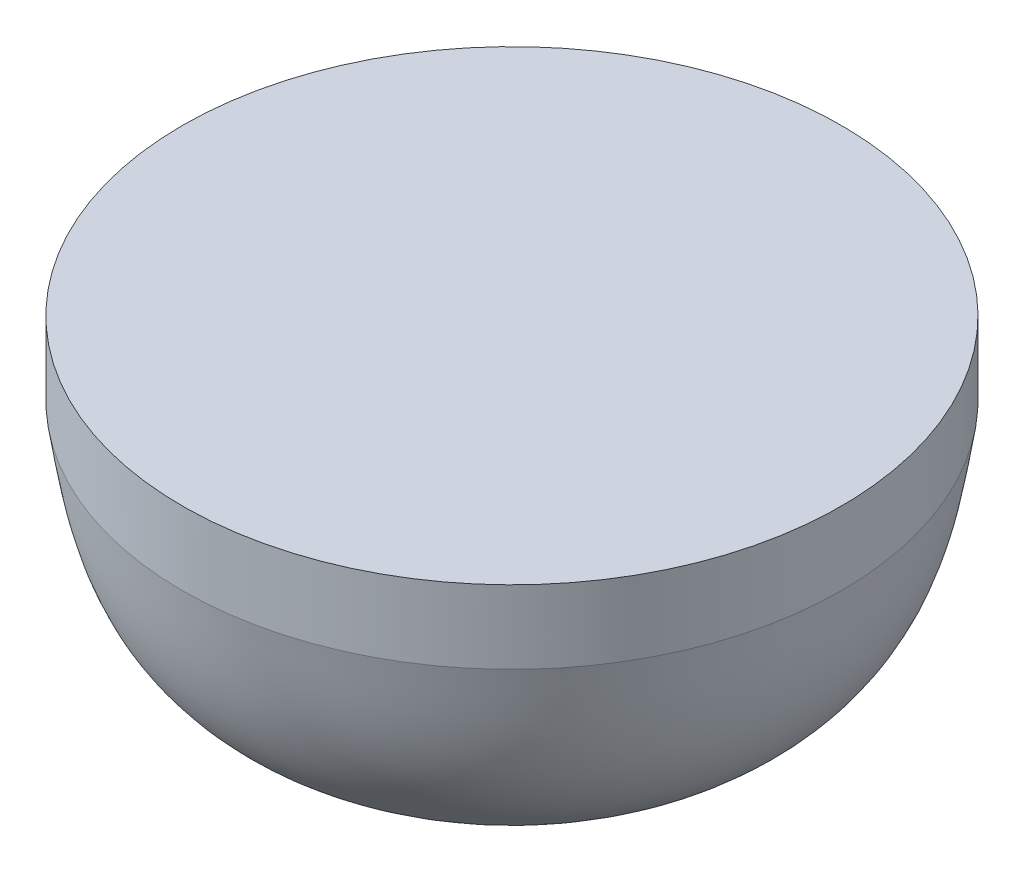
ISO-10303-21;
HEADER;
FILE_DESCRIPTION(('STEP AP214'),'2;1');
FILE_NAME('part.step','',(''),(''),'','','');
FILE_SCHEMA(('AUTOMOTIVE_DESIGN { 1 0 10303 214 1 1 1 1 }'));
ENDSEC;
DATA;
#1=APPLICATION_CONTEXT('core data for automotive mechanical design processes');
#2=APPLICATION_PROTOCOL_DEFINITION('international standard','automotive_design',2000,#1);
#3=PRODUCT_CONTEXT('',#1,'mechanical');
#4=PRODUCT('Part','Part','',(#3));
#5=PRODUCT_RELATED_PRODUCT_CATEGORY('part','',(#4));
#6=PRODUCT_DEFINITION_FORMATION('','',#4);
#7=PRODUCT_DEFINITION_CONTEXT('part definition',#1,'design');
#8=PRODUCT_DEFINITION('design','',#6,#7);
#9=PRODUCT_DEFINITION_SHAPE('','',#8);
#10=(LENGTH_UNIT() NAMED_UNIT(*) SI_UNIT(.MILLI.,.METRE.));
#11=(NAMED_UNIT(*) PLANE_ANGLE_UNIT() SI_UNIT($,.RADIAN.));
#12=(NAMED_UNIT(*) SI_UNIT($,.STERADIAN.) SOLID_ANGLE_UNIT());
#13=UNCERTAINTY_MEASURE_WITH_UNIT(LENGTH_MEASURE(1.E-05),#10,'distance_accuracy_value','');
#14=(GEOMETRIC_REPRESENTATION_CONTEXT(3) GLOBAL_UNCERTAINTY_ASSIGNED_CONTEXT((#13)) GLOBAL_UNIT_ASSIGNED_CONTEXT((#10,
#11,#12)) REPRESENTATION_CONTEXT('',''));
#15=CARTESIAN_POINT('',(0.,0.,0.));
#16=DIRECTION('',(0.,0.,1.));
#17=DIRECTION('',(1.,0.,0.));
#18=AXIS2_PLACEMENT_3D('',#15,#16,#17);
#19=CARTESIAN_POINT('',(18.,4.,0.));
#20=DIRECTION('',(0.,-1.,0.));
#21=DIRECTION('',(1.,0.,0.));
#22=AXIS2_PLACEMENT_3D('',#19,#20,#21);
#23=PLANE('',#22);
#24=CARTESIAN_POINT('',(0.,4.,0.));
#25=DIRECTION('',(0.,1.,0.));
#26=DIRECTION('',(-1.,0.,0.));
#27=AXIS2_PLACEMENT_3D('',#24,#25,#26);
#28=CIRCLE('',#27,18.);
#29=CARTESIAN_POINT('',(-18.,4.,0.));
#30=VERTEX_POINT('',#29);
#31=EDGE_CURVE('E11',#30,#30,#28,.T.);
#32=ORIENTED_EDGE('',*,*,#31,.T.);
#33=EDGE_LOOP('',(#32));
#34=FACE_BOUND('',#33,.T.);
#35=ADVANCED_FACE('F33',(#34),#23,.F.);
#36=CARTESIAN_POINT('',(0.,0.,0.));
#37=DIRECTION('',(0.,1.,0.));
#38=DIRECTION('',(-1.,0.,0.));
#39=AXIS2_PLACEMENT_3D('',#36,#37,#38);
#40=CYLINDRICAL_SURFACE('',#39,18.);
#41=ORIENTED_EDGE('',*,*,#31,.F.);
#42=EDGE_LOOP('',(#41));
#43=FACE_BOUND('',#42,.T.);
#44=CARTESIAN_POINT('',(0.,0.,0.));
#45=DIRECTION('',(0.,1.,0.));
#46=DIRECTION('',(-1.,0.,0.));
#47=AXIS2_PLACEMENT_3D('',#44,#45,#46);
#48=CIRCLE('',#47,18.);
#49=CARTESIAN_POINT('',(-18.,0.,0.));
#50=VERTEX_POINT('',#49);
#51=EDGE_CURVE('E39',#50,#50,#48,.T.);
#52=ORIENTED_EDGE('',*,*,#51,.T.);
#53=EDGE_LOOP('',(#52));
#54=FACE_BOUND('',#53,.T.);
#55=ADVANCED_FACE('F44',(#43,#54),#40,.T.);
#56=CARTESIAN_POINT('',(0.,-14.,0.));
#57=CARTESIAN_POINT('',(16.3895391420194,-14.,0.));
#58=CARTESIAN_POINT('',(17.019517420698,-6.05480984523949,0.));
#59=CARTESIAN_POINT('',(18.,0.,0.));
#60=B_SPLINE_CURVE_WITH_KNOTS('',3,(#56,#57,#58,#59),.UNSPECIFIED.,.F.,.F.,(4,4),(0.,1.),.UNSPECIFIED.);
#61=CARTESIAN_POINT('',(0.,0.,0.));
#62=DIRECTION('',(0.,1.,0.));
#63=AXIS1_PLACEMENT('',#61,#62);
#64=SURFACE_OF_REVOLUTION('',#60,#63);
#65=ORIENTED_EDGE('',*,*,#51,.F.);
#66=EDGE_LOOP('',(#65));
#67=FACE_BOUND('',#66,.T.);
#68=CARTESIAN_POINT('',(0.,-14.,0.));
#69=VERTEX_POINT('',#68);
#70=VERTEX_LOOP('',#69);
#71=FACE_BOUND('',#70,.T.);
#72=ADVANCED_FACE('F42',(#67,#71),#64,.T.);
#73=CLOSED_SHELL('',(#35,#55,#72));
#74=MANIFOLD_SOLID_BREP('B2',#73);
#75=ADVANCED_BREP_SHAPE_REPRESENTATION('',(#18,#74),#14);
#76=SHAPE_DEFINITION_REPRESENTATION(#9,#75);
ENDSEC;
END-ISO-10303-21;
